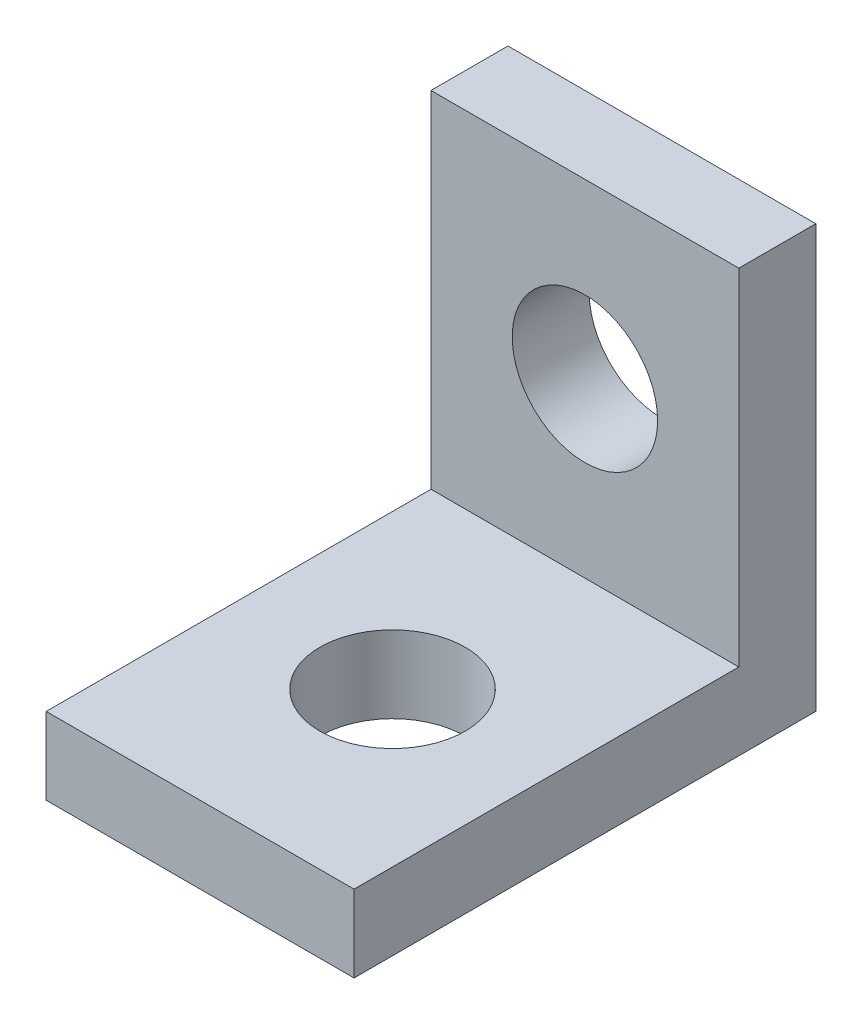
ISO-10303-21;
HEADER;
FILE_DESCRIPTION(('STEP AP214'),'2;1');
FILE_NAME('part.step','',(''),(''),'','','');
FILE_SCHEMA(('AUTOMOTIVE_DESIGN { 1 0 10303 214 1 1 1 1 }'));
ENDSEC;
DATA;
#1=APPLICATION_CONTEXT('core data for automotive mechanical design processes');
#2=APPLICATION_PROTOCOL_DEFINITION('international standard','automotive_design',2000,#1);
#3=PRODUCT_CONTEXT('',#1,'mechanical');
#4=PRODUCT('Part','Part','',(#3));
#5=PRODUCT_RELATED_PRODUCT_CATEGORY('part','',(#4));
#6=PRODUCT_DEFINITION_FORMATION('','',#4);
#7=PRODUCT_DEFINITION_CONTEXT('part definition',#1,'design');
#8=PRODUCT_DEFINITION('design','',#6,#7);
#9=PRODUCT_DEFINITION_SHAPE('','',#8);
#10=(LENGTH_UNIT() NAMED_UNIT(*) SI_UNIT(.MILLI.,.METRE.));
#11=(NAMED_UNIT(*) PLANE_ANGLE_UNIT() SI_UNIT($,.RADIAN.));
#12=(NAMED_UNIT(*) SI_UNIT($,.STERADIAN.) SOLID_ANGLE_UNIT());
#13=UNCERTAINTY_MEASURE_WITH_UNIT(LENGTH_MEASURE(1.E-05),#10,'distance_accuracy_value','');
#14=(GEOMETRIC_REPRESENTATION_CONTEXT(3) GLOBAL_UNCERTAINTY_ASSIGNED_CONTEXT((#13)) GLOBAL_UNIT_ASSIGNED_CONTEXT((#10,
#11,#12)) REPRESENTATION_CONTEXT('',''));
#15=CARTESIAN_POINT('',(0.,0.,0.));
#16=DIRECTION('',(0.,0.,1.));
#17=DIRECTION('',(1.,0.,0.));
#18=AXIS2_PLACEMENT_3D('',#15,#16,#17);
#19=CARTESIAN_POINT('',(-3.175,1.5875,-4.7625));
#20=DIRECTION('',(1.,0.,0.));
#21=DIRECTION('',(0.,0.,-1.));
#22=AXIS2_PLACEMENT_3D('',#19,#20,#21);
#23=PLANE('',#22);
#24=DIRECTION('',(0.,0.,1.));
#25=VECTOR('',#24,1.);
#26=CARTESIAN_POINT('',(-3.175,0.,-4.7625));
#27=LINE('',#26,#25);
#28=CARTESIAN_POINT('',(-3.175,0.,-4.7625));
#29=VERTEX_POINT('',#28);
#30=CARTESIAN_POINT('',(-3.175,0.,4.7625));
#31=VERTEX_POINT('',#30);
#32=EDGE_CURVE('E78',#29,#31,#27,.T.);
#33=ORIENTED_EDGE('',*,*,#32,.T.);
#34=DIRECTION('',(0.,-1.,0.));
#35=VECTOR('',#34,1.);
#36=CARTESIAN_POINT('',(-3.175,1.5875,4.7625));
#37=LINE('',#36,#35);
#38=CARTESIAN_POINT('',(-3.175,1.5875,4.7625));
#39=VERTEX_POINT('',#38);
#40=EDGE_CURVE('E11',#39,#31,#37,.T.);
#41=ORIENTED_EDGE('',*,*,#40,.F.);
#42=DIRECTION('',(0.,0.,1.));
#43=VECTOR('',#42,1.);
#44=CARTESIAN_POINT('',(-3.175,1.5875,-4.7625));
#45=LINE('',#44,#43);
#46=CARTESIAN_POINT('',(-3.175,1.5875,-3.175));
#47=VERTEX_POINT('',#46);
#48=EDGE_CURVE('E100',#47,#39,#45,.T.);
#49=ORIENTED_EDGE('',*,*,#48,.F.);
#50=DIRECTION('',(0.,-1.,0.));
#51=VECTOR('',#50,1.);
#52=CARTESIAN_POINT('',(-3.175,8.7122,-3.175));
#53=LINE('',#52,#51);
#54=CARTESIAN_POINT('',(-3.175,8.7122,-3.175));
#55=VERTEX_POINT('',#54);
#56=EDGE_CURVE('E95',#55,#47,#53,.T.);
#57=ORIENTED_EDGE('',*,*,#56,.F.);
#58=DIRECTION('',(0.,0.,1.));
#59=VECTOR('',#58,1.);
#60=CARTESIAN_POINT('',(-3.175,8.7122,-4.7625));
#61=LINE('',#60,#59);
#62=CARTESIAN_POINT('',(-3.175,8.7122,-4.7625));
#63=VERTEX_POINT('',#62);
#64=EDGE_CURVE('E81',#63,#55,#61,.T.);
#65=ORIENTED_EDGE('',*,*,#64,.F.);
#66=DIRECTION('',(0.,-1.,0.));
#67=VECTOR('',#66,1.);
#68=CARTESIAN_POINT('',(-3.175,1.5875,-4.7625));
#69=LINE('',#68,#67);
#70=EDGE_CURVE('E75',#63,#29,#69,.T.);
#71=ORIENTED_EDGE('',*,*,#70,.T.);
#72=EDGE_LOOP('',(#33,#41,#49,#57,#65,#71));
#73=FACE_BOUND('',#72,.T.);
#74=ADVANCED_FACE('F32',(#73),#23,.F.);
#75=CARTESIAN_POINT('',(-3.175,1.5875,4.7625));
#76=DIRECTION('',(0.,0.,-1.));
#77=DIRECTION('',(-1.,0.,0.));
#78=AXIS2_PLACEMENT_3D('',#75,#76,#77);
#79=PLANE('',#78);
#80=DIRECTION('',(1.,0.,0.));
#81=VECTOR('',#80,1.);
#82=CARTESIAN_POINT('',(-3.175,0.,4.7625));
#83=LINE('',#82,#81);
#84=CARTESIAN_POINT('',(3.175,0.,4.7625));
#85=VERTEX_POINT('',#84);
#86=EDGE_CURVE('E94',#31,#85,#83,.T.);
#87=ORIENTED_EDGE('',*,*,#86,.T.);
#88=DIRECTION('',(0.,-1.,0.));
#89=VECTOR('',#88,1.);
#90=CARTESIAN_POINT('',(3.175,1.5875,4.7625));
#91=LINE('',#90,#89);
#92=CARTESIAN_POINT('',(3.175,1.5875,4.7625));
#93=VERTEX_POINT('',#92);
#94=EDGE_CURVE('E40',#93,#85,#91,.T.);
#95=ORIENTED_EDGE('',*,*,#94,.F.);
#96=DIRECTION('',(1.,0.,0.));
#97=VECTOR('',#96,1.);
#98=CARTESIAN_POINT('',(-3.175,1.5875,4.7625));
#99=LINE('',#98,#97);
#100=EDGE_CURVE('E103',#39,#93,#99,.T.);
#101=ORIENTED_EDGE('',*,*,#100,.F.);
#102=ORIENTED_EDGE('',*,*,#40,.T.);
#103=EDGE_LOOP('',(#87,#95,#101,#102));
#104=FACE_BOUND('',#103,.T.);
#105=ADVANCED_FACE('F121',(#104),#79,.F.);
#106=CARTESIAN_POINT('',(3.175,1.5875,-4.7625));
#107=DIRECTION('',(1.,0.,0.));
#108=DIRECTION('',(0.,0.,-1.));
#109=AXIS2_PLACEMENT_3D('',#106,#107,#108);
#110=PLANE('',#109);
#111=DIRECTION('',(0.,0.,1.));
#112=VECTOR('',#111,1.);
#113=CARTESIAN_POINT('',(3.175,0.,-4.7625));
#114=LINE('',#113,#112);
#115=CARTESIAN_POINT('',(3.175,0.,-4.7625));
#116=VERTEX_POINT('',#115);
#117=EDGE_CURVE('E101',#116,#85,#114,.T.);
#118=ORIENTED_EDGE('',*,*,#117,.F.);
#119=DIRECTION('',(0.,-1.,0.));
#120=VECTOR('',#119,1.);
#121=CARTESIAN_POINT('',(3.175,1.5875,-4.7625));
#122=LINE('',#121,#120);
#123=CARTESIAN_POINT('',(3.175,8.7122,-4.7625));
#124=VERTEX_POINT('',#123);
#125=EDGE_CURVE('E86',#124,#116,#122,.T.);
#126=ORIENTED_EDGE('',*,*,#125,.F.);
#127=DIRECTION('',(0.,0.,-1.));
#128=VECTOR('',#127,1.);
#129=CARTESIAN_POINT('',(3.175,8.7122,-4.7625));
#130=LINE('',#129,#128);
#131=CARTESIAN_POINT('',(3.175,8.7122,-3.175));
#132=VERTEX_POINT('',#131);
#133=EDGE_CURVE('E128',#132,#124,#130,.T.);
#134=ORIENTED_EDGE('',*,*,#133,.F.);
#135=DIRECTION('',(0.,-1.,0.));
#136=VECTOR('',#135,1.);
#137=CARTESIAN_POINT('',(3.175,8.7122,-3.175));
#138=LINE('',#137,#136);
#139=CARTESIAN_POINT('',(3.175,1.5875,-3.175));
#140=VERTEX_POINT('',#139);
#141=EDGE_CURVE('E138',#132,#140,#138,.T.);
#142=ORIENTED_EDGE('',*,*,#141,.T.);
#143=DIRECTION('',(0.,0.,1.));
#144=VECTOR('',#143,1.);
#145=CARTESIAN_POINT('',(3.175,1.5875,-4.7625));
#146=LINE('',#145,#144);
#147=EDGE_CURVE('E56',#140,#93,#146,.T.);
#148=ORIENTED_EDGE('',*,*,#147,.T.);
#149=ORIENTED_EDGE('',*,*,#94,.T.);
#150=EDGE_LOOP('',(#118,#126,#134,#142,#148,#149));
#151=FACE_BOUND('',#150,.T.);
#152=ADVANCED_FACE('F123',(#151),#110,.T.);
#153=CARTESIAN_POINT('',(-3.175,1.5875,-4.7625));
#154=DIRECTION('',(0.,0.,-1.));
#155=DIRECTION('',(-1.,0.,0.));
#156=AXIS2_PLACEMENT_3D('',#153,#154,#155);
#157=PLANE('',#156);
#158=CARTESIAN_POINT('',(0.,5.14985,-4.7625));
#159=DIRECTION('',(0.,0.,-1.));
#160=DIRECTION('',(-1.,0.,0.));
#161=AXIS2_PLACEMENT_3D('',#158,#159,#160);
#162=CIRCLE('',#161,1.49999999999999);
#163=CARTESIAN_POINT('',(-1.49999999999999,5.14985,-4.7625));
#164=VERTEX_POINT('',#163);
#165=EDGE_CURVE('E149',#164,#164,#162,.T.);
#166=ORIENTED_EDGE('',*,*,#165,.F.);
#167=EDGE_LOOP('',(#166));
#168=FACE_BOUND('',#167,.T.);
#169=DIRECTION('',(1.,0.,0.));
#170=VECTOR('',#169,1.);
#171=CARTESIAN_POINT('',(-3.175,0.,-4.7625));
#172=LINE('',#171,#170);
#173=EDGE_CURVE('E92',#29,#116,#172,.T.);
#174=ORIENTED_EDGE('',*,*,#173,.F.);
#175=ORIENTED_EDGE('',*,*,#70,.F.);
#176=DIRECTION('',(-1.,0.,0.));
#177=VECTOR('',#176,1.);
#178=CARTESIAN_POINT('',(-3.175,8.7122,-4.7625));
#179=LINE('',#178,#177);
#180=EDGE_CURVE('E133',#124,#63,#179,.T.);
#181=ORIENTED_EDGE('',*,*,#180,.F.);
#182=ORIENTED_EDGE('',*,*,#125,.T.);
#183=EDGE_LOOP('',(#174,#175,#181,#182));
#184=FACE_BOUND('',#183,.T.);
#185=ADVANCED_FACE('F97',(#168,#184),#157,.T.);
#186=CARTESIAN_POINT('',(0.,1.5875,0.));
#187=DIRECTION('',(0.,1.,0.));
#188=DIRECTION('',(0.,0.,1.));
#189=AXIS2_PLACEMENT_3D('',#186,#187,#188);
#190=PLANE('',#189);
#191=CARTESIAN_POINT('',(0.,1.5875,0.79375));
#192=DIRECTION('',(0.,1.,0.));
#193=DIRECTION('',(0.,0.,1.));
#194=AXIS2_PLACEMENT_3D('',#191,#192,#193);
#195=CIRCLE('',#194,1.5);
#196=CARTESIAN_POINT('',(0.,1.5875,2.29375));
#197=VERTEX_POINT('',#196);
#198=EDGE_CURVE('E146',#197,#197,#195,.T.);
#199=ORIENTED_EDGE('',*,*,#198,.F.);
#200=EDGE_LOOP('',(#199));
#201=FACE_BOUND('',#200,.T.);
#202=DIRECTION('',(1.,0.,0.));
#203=VECTOR('',#202,1.);
#204=CARTESIAN_POINT('',(-3.175,1.5875,-3.175));
#205=LINE('',#204,#203);
#206=EDGE_CURVE('E48',#47,#140,#205,.T.);
#207=ORIENTED_EDGE('',*,*,#206,.F.);
#208=ORIENTED_EDGE('',*,*,#48,.T.);
#209=ORIENTED_EDGE('',*,*,#100,.T.);
#210=ORIENTED_EDGE('',*,*,#147,.F.);
#211=EDGE_LOOP('',(#207,#208,#209,#210));
#212=FACE_BOUND('',#211,.T.);
#213=ADVANCED_FACE('F170',(#201,#212),#190,.T.);
#214=CARTESIAN_POINT('',(0.,0.,0.));
#215=DIRECTION('',(0.,1.,0.));
#216=DIRECTION('',(0.,0.,1.));
#217=AXIS2_PLACEMENT_3D('',#214,#215,#216);
#218=PLANE('',#217);
#219=CARTESIAN_POINT('',(0.,0.,0.79375));
#220=DIRECTION('',(0.,1.,0.));
#221=DIRECTION('',(0.,0.,1.));
#222=AXIS2_PLACEMENT_3D('',#219,#220,#221);
#223=CIRCLE('',#222,1.5);
#224=CARTESIAN_POINT('',(0.,0.,2.29375));
#225=VERTEX_POINT('',#224);
#226=EDGE_CURVE('E143',#225,#225,#223,.T.);
#227=ORIENTED_EDGE('',*,*,#226,.T.);
#228=EDGE_LOOP('',(#227));
#229=FACE_BOUND('',#228,.T.);
#230=ORIENTED_EDGE('',*,*,#32,.F.);
#231=ORIENTED_EDGE('',*,*,#173,.T.);
#232=ORIENTED_EDGE('',*,*,#117,.T.);
#233=ORIENTED_EDGE('',*,*,#86,.F.);
#234=EDGE_LOOP('',(#230,#231,#232,#233));
#235=FACE_BOUND('',#234,.T.);
#236=ADVANCED_FACE('F90',(#229,#235),#218,.F.);
#237=CARTESIAN_POINT('',(-3.175,8.7122,-3.175));
#238=DIRECTION('',(0.,0.,-1.));
#239=DIRECTION('',(-1.,0.,0.));
#240=AXIS2_PLACEMENT_3D('',#237,#238,#239);
#241=PLANE('',#240);
#242=CARTESIAN_POINT('',(0.,5.14985,-3.175));
#243=DIRECTION('',(0.,0.,1.));
#244=DIRECTION('',(1.,0.,0.));
#245=AXIS2_PLACEMENT_3D('',#242,#243,#244);
#246=CIRCLE('',#245,1.49999999999999);
#247=CARTESIAN_POINT('',(1.49999999999999,5.14985,-3.175));
#248=VERTEX_POINT('',#247);
#249=EDGE_CURVE('E152',#248,#248,#246,.T.);
#250=ORIENTED_EDGE('',*,*,#249,.F.);
#251=EDGE_LOOP('',(#250));
#252=FACE_BOUND('',#251,.T.);
#253=ORIENTED_EDGE('',*,*,#206,.T.);
#254=ORIENTED_EDGE('',*,*,#141,.F.);
#255=DIRECTION('',(1.,0.,0.));
#256=VECTOR('',#255,1.);
#257=CARTESIAN_POINT('',(-3.175,8.7122,-3.175));
#258=LINE('',#257,#256);
#259=EDGE_CURVE('E135',#55,#132,#258,.T.);
#260=ORIENTED_EDGE('',*,*,#259,.F.);
#261=ORIENTED_EDGE('',*,*,#56,.T.);
#262=EDGE_LOOP('',(#253,#254,#260,#261));
#263=FACE_BOUND('',#262,.T.);
#264=ADVANCED_FACE('F158',(#252,#263),#241,.F.);
#265=CARTESIAN_POINT('',(0.,8.7122,0.));
#266=DIRECTION('',(0.,1.,0.));
#267=DIRECTION('',(0.,0.,1.));
#268=AXIS2_PLACEMENT_3D('',#265,#266,#267);
#269=PLANE('',#268);
#270=ORIENTED_EDGE('',*,*,#64,.T.);
#271=ORIENTED_EDGE('',*,*,#259,.T.);
#272=ORIENTED_EDGE('',*,*,#133,.T.);
#273=ORIENTED_EDGE('',*,*,#180,.T.);
#274=EDGE_LOOP('',(#270,#271,#272,#273));
#275=FACE_BOUND('',#274,.T.);
#276=ADVANCED_FACE('F132',(#275),#269,.T.);
#277=CARTESIAN_POINT('',(0.,1.5875,0.79375));
#278=DIRECTION('',(0.,1.,0.));
#279=DIRECTION('',(0.,0.,1.));
#280=AXIS2_PLACEMENT_3D('',#277,#278,#279);
#281=CYLINDRICAL_SURFACE('',#280,1.5);
#282=ORIENTED_EDGE('',*,*,#226,.F.);
#283=EDGE_LOOP('',(#282));
#284=FACE_BOUND('',#283,.T.);
#285=ORIENTED_EDGE('',*,*,#198,.T.);
#286=EDGE_LOOP('',(#285));
#287=FACE_BOUND('',#286,.T.);
#288=ADVANCED_FACE('F206',(#284,#287),#281,.F.);
#289=CARTESIAN_POINT('',(0.,5.14985,-3.175));
#290=DIRECTION('',(0.,0.,1.));
#291=DIRECTION('',(1.,0.,0.));
#292=AXIS2_PLACEMENT_3D('',#289,#290,#291);
#293=CYLINDRICAL_SURFACE('',#292,1.49999999999999);
#294=ORIENTED_EDGE('',*,*,#165,.T.);
#295=EDGE_LOOP('',(#294));
#296=FACE_BOUND('',#295,.T.);
#297=ORIENTED_EDGE('',*,*,#249,.T.);
#298=EDGE_LOOP('',(#297));
#299=FACE_BOUND('',#298,.T.);
#300=ADVANCED_FACE('F156',(#296,#299),#293,.F.);
#301=CLOSED_SHELL('',(#74,#105,#152,#185,#213,#236,#264,#276,#288,#300));
#302=MANIFOLD_SOLID_BREP('B2',#301);
#303=ADVANCED_BREP_SHAPE_REPRESENTATION('',(#18,#302),#14);
#304=SHAPE_DEFINITION_REPRESENTATION(#9,#303);
ENDSEC;
END-ISO-10303-21;
